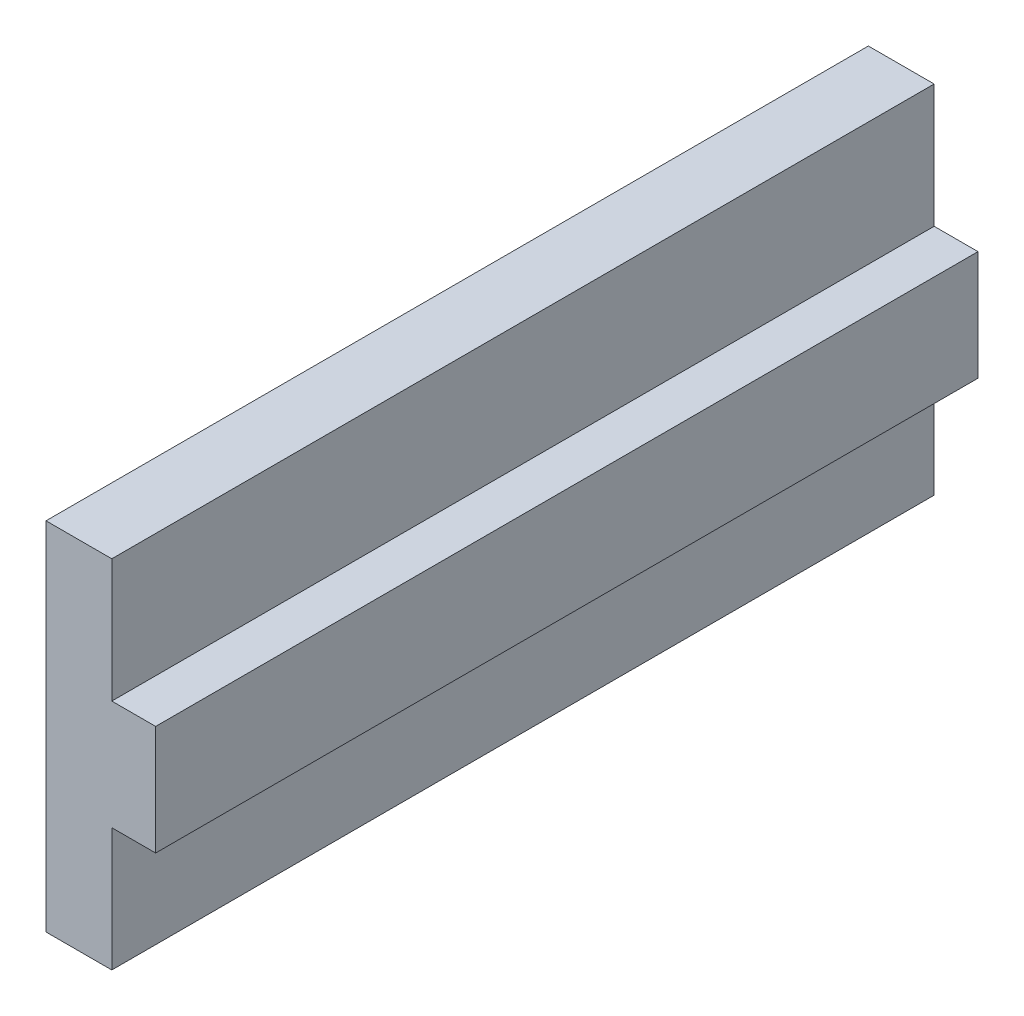
ISO-10303-21;
HEADER;
FILE_DESCRIPTION(('STEP AP214'),'2;1');
FILE_NAME('part.step','',(''),(''),'','','');
FILE_SCHEMA(('AUTOMOTIVE_DESIGN { 1 0 10303 214 1 1 1 1 }'));
ENDSEC;
DATA;
#1=APPLICATION_CONTEXT('core data for automotive mechanical design processes');
#2=APPLICATION_PROTOCOL_DEFINITION('international standard','automotive_design',2000,#1);
#3=PRODUCT_CONTEXT('',#1,'mechanical');
#4=PRODUCT('Part','Part','',(#3));
#5=PRODUCT_RELATED_PRODUCT_CATEGORY('part','',(#4));
#6=PRODUCT_DEFINITION_FORMATION('','',#4);
#7=PRODUCT_DEFINITION_CONTEXT('part definition',#1,'design');
#8=PRODUCT_DEFINITION('design','',#6,#7);
#9=PRODUCT_DEFINITION_SHAPE('','',#8);
#10=(LENGTH_UNIT() NAMED_UNIT(*) SI_UNIT(.MILLI.,.METRE.));
#11=(NAMED_UNIT(*) PLANE_ANGLE_UNIT() SI_UNIT($,.RADIAN.));
#12=(NAMED_UNIT(*) SI_UNIT($,.STERADIAN.) SOLID_ANGLE_UNIT());
#13=UNCERTAINTY_MEASURE_WITH_UNIT(LENGTH_MEASURE(1.E-05),#10,'distance_accuracy_value','');
#14=(GEOMETRIC_REPRESENTATION_CONTEXT(3) GLOBAL_UNCERTAINTY_ASSIGNED_CONTEXT((#13)) GLOBAL_UNIT_ASSIGNED_CONTEXT((#10,
#11,#12)) REPRESENTATION_CONTEXT('',''));
#15=CARTESIAN_POINT('',(0.,0.,0.));
#16=DIRECTION('',(0.,0.,1.));
#17=DIRECTION('',(1.,0.,0.));
#18=AXIS2_PLACEMENT_3D('',#15,#16,#17);
#19=CARTESIAN_POINT('',(3.81,0.,47.625));
#20=DIRECTION('',(0.,1.,0.));
#21=DIRECTION('',(-1.,0.,0.));
#22=AXIS2_PLACEMENT_3D('',#19,#20,#21);
#23=PLANE('',#22);
#24=DIRECTION('',(1.,0.,0.));
#25=VECTOR('',#24,1.);
#26=CARTESIAN_POINT('',(3.81,0.,0.));
#27=LINE('',#26,#25);
#28=CARTESIAN_POINT('',(0.,0.,0.));
#29=VERTEX_POINT('',#28);
#30=CARTESIAN_POINT('',(3.81,0.,0.));
#31=VERTEX_POINT('',#30);
#32=EDGE_CURVE('E131',#29,#31,#27,.T.);
#33=ORIENTED_EDGE('',*,*,#32,.T.);
#34=DIRECTION('',(0.,0.,-1.));
#35=VECTOR('',#34,1.);
#36=CARTESIAN_POINT('',(3.81,0.,47.625));
#37=LINE('',#36,#35);
#38=CARTESIAN_POINT('',(3.81,0.,47.625));
#39=VERTEX_POINT('',#38);
#40=EDGE_CURVE('E11',#39,#31,#37,.T.);
#41=ORIENTED_EDGE('',*,*,#40,.F.);
#42=DIRECTION('',(1.,0.,0.));
#43=VECTOR('',#42,1.);
#44=CARTESIAN_POINT('',(3.81,0.,47.625));
#45=LINE('',#44,#43);
#46=CARTESIAN_POINT('',(0.,0.,47.625));
#47=VERTEX_POINT('',#46);
#48=EDGE_CURVE('E145',#47,#39,#45,.T.);
#49=ORIENTED_EDGE('',*,*,#48,.F.);
#50=DIRECTION('',(0.,0.,-1.));
#51=VECTOR('',#50,1.);
#52=CARTESIAN_POINT('',(0.,0.,47.625));
#53=LINE('',#52,#51);
#54=EDGE_CURVE('E127',#47,#29,#53,.T.);
#55=ORIENTED_EDGE('',*,*,#54,.T.);
#56=EDGE_LOOP('',(#33,#41,#49,#55));
#57=FACE_BOUND('',#56,.T.);
#58=ADVANCED_FACE('F35',(#57),#23,.F.);
#59=CARTESIAN_POINT('',(3.81,7.1374,47.625));
#60=DIRECTION('',(-1.,0.,0.));
#61=DIRECTION('',(0.,0.,1.));
#62=AXIS2_PLACEMENT_3D('',#59,#60,#61);
#63=PLANE('',#62);
#64=DIRECTION('',(0.,1.,0.));
#65=VECTOR('',#64,1.);
#66=CARTESIAN_POINT('',(3.81,7.1374,0.));
#67=LINE('',#66,#65);
#68=CARTESIAN_POINT('',(3.81,7.1374,0.));
#69=VERTEX_POINT('',#68);
#70=EDGE_CURVE('E134',#31,#69,#67,.T.);
#71=ORIENTED_EDGE('',*,*,#70,.T.);
#72=DIRECTION('',(0.,0.,-1.));
#73=VECTOR('',#72,1.);
#74=CARTESIAN_POINT('',(3.81,7.1374,47.625));
#75=LINE('',#74,#73);
#76=CARTESIAN_POINT('',(3.81,7.1374,47.625));
#77=VERTEX_POINT('',#76);
#78=EDGE_CURVE('E43',#77,#69,#75,.T.);
#79=ORIENTED_EDGE('',*,*,#78,.F.);
#80=DIRECTION('',(0.,1.,0.));
#81=VECTOR('',#80,1.);
#82=CARTESIAN_POINT('',(3.81,7.1374,47.625));
#83=LINE('',#82,#81);
#84=EDGE_CURVE('E94',#39,#77,#83,.T.);
#85=ORIENTED_EDGE('',*,*,#84,.F.);
#86=ORIENTED_EDGE('',*,*,#40,.T.);
#87=EDGE_LOOP('',(#71,#79,#85,#86));
#88=FACE_BOUND('',#87,.T.);
#89=ADVANCED_FACE('F180',(#88),#63,.F.);
#90=CARTESIAN_POINT('',(6.35,7.1374,47.625));
#91=DIRECTION('',(0.,1.,0.));
#92=DIRECTION('',(-1.,0.,0.));
#93=AXIS2_PLACEMENT_3D('',#90,#91,#92);
#94=PLANE('',#93);
#95=DIRECTION('',(1.,0.,0.));
#96=VECTOR('',#95,1.);
#97=CARTESIAN_POINT('',(6.35,7.1374,0.));
#98=LINE('',#97,#96);
#99=CARTESIAN_POINT('',(6.35,7.1374,0.));
#100=VERTEX_POINT('',#99);
#101=EDGE_CURVE('E136',#69,#100,#98,.T.);
#102=ORIENTED_EDGE('',*,*,#101,.T.);
#103=DIRECTION('',(0.,0.,-1.));
#104=VECTOR('',#103,1.);
#105=CARTESIAN_POINT('',(6.35,7.1374,47.625));
#106=LINE('',#105,#104);
#107=CARTESIAN_POINT('',(6.35,7.1374,47.625));
#108=VERTEX_POINT('',#107);
#109=EDGE_CURVE('E152',#108,#100,#106,.T.);
#110=ORIENTED_EDGE('',*,*,#109,.F.);
#111=DIRECTION('',(1.,0.,0.));
#112=VECTOR('',#111,1.);
#113=CARTESIAN_POINT('',(6.35,7.1374,47.625));
#114=LINE('',#113,#112);
#115=EDGE_CURVE('E160',#77,#108,#114,.T.);
#116=ORIENTED_EDGE('',*,*,#115,.F.);
#117=ORIENTED_EDGE('',*,*,#78,.T.);
#118=EDGE_LOOP('',(#102,#110,#116,#117));
#119=FACE_BOUND('',#118,.T.);
#120=ADVANCED_FACE('F158',(#119),#94,.F.);
#121=CARTESIAN_POINT('',(6.35,13.4874,47.625));
#122=DIRECTION('',(-1.,0.,0.));
#123=DIRECTION('',(0.,0.,1.));
#124=AXIS2_PLACEMENT_3D('',#121,#122,#123);
#125=PLANE('',#124);
#126=DIRECTION('',(0.,1.,0.));
#127=VECTOR('',#126,1.);
#128=CARTESIAN_POINT('',(6.35,13.4874,0.));
#129=LINE('',#128,#127);
#130=CARTESIAN_POINT('',(6.35,13.4874,0.));
#131=VERTEX_POINT('',#130);
#132=EDGE_CURVE('E138',#100,#131,#129,.T.);
#133=ORIENTED_EDGE('',*,*,#132,.T.);
#134=DIRECTION('',(0.,0.,-1.));
#135=VECTOR('',#134,1.);
#136=CARTESIAN_POINT('',(6.35,13.4874,47.625));
#137=LINE('',#136,#135);
#138=CARTESIAN_POINT('',(6.35,13.4874,47.625));
#139=VERTEX_POINT('',#138);
#140=EDGE_CURVE('E149',#139,#131,#137,.T.);
#141=ORIENTED_EDGE('',*,*,#140,.F.);
#142=DIRECTION('',(0.,1.,0.));
#143=VECTOR('',#142,1.);
#144=CARTESIAN_POINT('',(6.35,13.4874,47.625));
#145=LINE('',#144,#143);
#146=EDGE_CURVE('E172',#108,#139,#145,.T.);
#147=ORIENTED_EDGE('',*,*,#146,.F.);
#148=ORIENTED_EDGE('',*,*,#109,.T.);
#149=EDGE_LOOP('',(#133,#141,#147,#148));
#150=FACE_BOUND('',#149,.T.);
#151=ADVANCED_FACE('F168',(#150),#125,.F.);
#152=CARTESIAN_POINT('',(3.81,13.4874,47.625));
#153=DIRECTION('',(0.,-1.,0.));
#154=DIRECTION('',(1.,0.,0.));
#155=AXIS2_PLACEMENT_3D('',#152,#153,#154);
#156=PLANE('',#155);
#157=DIRECTION('',(-1.,0.,0.));
#158=VECTOR('',#157,1.);
#159=CARTESIAN_POINT('',(3.81,13.4874,0.));
#160=LINE('',#159,#158);
#161=CARTESIAN_POINT('',(3.81,13.4874,0.));
#162=VERTEX_POINT('',#161);
#163=EDGE_CURVE('E140',#131,#162,#160,.T.);
#164=ORIENTED_EDGE('',*,*,#163,.T.);
#165=DIRECTION('',(0.,0.,-1.));
#166=VECTOR('',#165,1.);
#167=CARTESIAN_POINT('',(3.81,13.4874,47.625));
#168=LINE('',#167,#166);
#169=CARTESIAN_POINT('',(3.81,13.4874,47.625));
#170=VERTEX_POINT('',#169);
#171=EDGE_CURVE('E122',#170,#162,#168,.T.);
#172=ORIENTED_EDGE('',*,*,#171,.F.);
#173=DIRECTION('',(-1.,0.,0.));
#174=VECTOR('',#173,1.);
#175=CARTESIAN_POINT('',(3.81,13.4874,47.625));
#176=LINE('',#175,#174);
#177=EDGE_CURVE('E113',#139,#170,#176,.T.);
#178=ORIENTED_EDGE('',*,*,#177,.F.);
#179=ORIENTED_EDGE('',*,*,#140,.T.);
#180=EDGE_LOOP('',(#164,#172,#178,#179));
#181=FACE_BOUND('',#180,.T.);
#182=ADVANCED_FACE('F171',(#181),#156,.F.);
#183=CARTESIAN_POINT('',(3.81,20.6248,47.625));
#184=DIRECTION('',(-1.,0.,0.));
#185=DIRECTION('',(0.,-1.,0.));
#186=AXIS2_PLACEMENT_3D('',#183,#184,#185);
#187=PLANE('',#186);
#188=DIRECTION('',(0.,1.,0.));
#189=VECTOR('',#188,1.);
#190=CARTESIAN_POINT('',(3.81,20.6248,0.));
#191=LINE('',#190,#189);
#192=CARTESIAN_POINT('',(3.81,20.6248,0.));
#193=VERTEX_POINT('',#192);
#194=EDGE_CURVE('E121',#162,#193,#191,.T.);
#195=ORIENTED_EDGE('',*,*,#194,.T.);
#196=DIRECTION('',(0.,0.,-1.));
#197=VECTOR('',#196,1.);
#198=CARTESIAN_POINT('',(3.81,20.6248,47.625));
#199=LINE('',#198,#197);
#200=CARTESIAN_POINT('',(3.81,20.6248,47.625));
#201=VERTEX_POINT('',#200);
#202=EDGE_CURVE('E118',#201,#193,#199,.T.);
#203=ORIENTED_EDGE('',*,*,#202,.F.);
#204=DIRECTION('',(0.,1.,0.));
#205=VECTOR('',#204,1.);
#206=CARTESIAN_POINT('',(3.81,20.6248,47.625));
#207=LINE('',#206,#205);
#208=EDGE_CURVE('E107',#170,#201,#207,.T.);
#209=ORIENTED_EDGE('',*,*,#208,.F.);
#210=ORIENTED_EDGE('',*,*,#171,.T.);
#211=EDGE_LOOP('',(#195,#203,#209,#210));
#212=FACE_BOUND('',#211,.T.);
#213=ADVANCED_FACE('F119',(#212),#187,.F.);
#214=CARTESIAN_POINT('',(0.,20.6248,47.625));
#215=DIRECTION('',(0.,-1.,0.));
#216=DIRECTION('',(0.,0.,-1.));
#217=AXIS2_PLACEMENT_3D('',#214,#215,#216);
#218=PLANE('',#217);
#219=DIRECTION('',(-1.,0.,0.));
#220=VECTOR('',#219,1.);
#221=CARTESIAN_POINT('',(0.,20.6248,0.));
#222=LINE('',#221,#220);
#223=CARTESIAN_POINT('',(0.,20.6248,0.));
#224=VERTEX_POINT('',#223);
#225=EDGE_CURVE('E80',#193,#224,#222,.T.);
#226=ORIENTED_EDGE('',*,*,#225,.T.);
#227=DIRECTION('',(0.,0.,-1.));
#228=VECTOR('',#227,1.);
#229=CARTESIAN_POINT('',(0.,20.6248,47.625));
#230=LINE('',#229,#228);
#231=CARTESIAN_POINT('',(0.,20.6248,47.625));
#232=VERTEX_POINT('',#231);
#233=EDGE_CURVE('E123',#232,#224,#230,.T.);
#234=ORIENTED_EDGE('',*,*,#233,.F.);
#235=DIRECTION('',(-1.,0.,0.));
#236=VECTOR('',#235,1.);
#237=CARTESIAN_POINT('',(0.,20.6248,47.625));
#238=LINE('',#237,#236);
#239=EDGE_CURVE('E111',#201,#232,#238,.T.);
#240=ORIENTED_EDGE('',*,*,#239,.F.);
#241=ORIENTED_EDGE('',*,*,#202,.T.);
#242=EDGE_LOOP('',(#226,#234,#240,#241));
#243=FACE_BOUND('',#242,.T.);
#244=ADVANCED_FACE('F125',(#243),#218,.F.);
#245=CARTESIAN_POINT('',(0.,0.,47.625));
#246=DIRECTION('',(1.,0.,0.));
#247=DIRECTION('',(0.,0.,-1.));
#248=AXIS2_PLACEMENT_3D('',#245,#246,#247);
#249=PLANE('',#248);
#250=DIRECTION('',(0.,-1.,0.));
#251=VECTOR('',#250,1.);
#252=CARTESIAN_POINT('',(0.,0.,0.));
#253=LINE('',#252,#251);
#254=EDGE_CURVE('E86',#224,#29,#253,.T.);
#255=ORIENTED_EDGE('',*,*,#254,.T.);
#256=ORIENTED_EDGE('',*,*,#54,.F.);
#257=DIRECTION('',(0.,-1.,0.));
#258=VECTOR('',#257,1.);
#259=CARTESIAN_POINT('',(0.,0.,47.625));
#260=LINE('',#259,#258);
#261=EDGE_CURVE('E51',#232,#47,#260,.T.);
#262=ORIENTED_EDGE('',*,*,#261,.F.);
#263=ORIENTED_EDGE('',*,*,#233,.T.);
#264=EDGE_LOOP('',(#255,#256,#262,#263));
#265=FACE_BOUND('',#264,.T.);
#266=ADVANCED_FACE('F196',(#265),#249,.F.);
#267=CARTESIAN_POINT('',(0.,0.,47.625));
#268=DIRECTION('',(0.,0.,-1.));
#269=DIRECTION('',(-1.,0.,0.));
#270=AXIS2_PLACEMENT_3D('',#267,#268,#269);
#271=PLANE('',#270);
#272=ORIENTED_EDGE('',*,*,#48,.T.);
#273=ORIENTED_EDGE('',*,*,#84,.T.);
#274=ORIENTED_EDGE('',*,*,#115,.T.);
#275=ORIENTED_EDGE('',*,*,#146,.T.);
#276=ORIENTED_EDGE('',*,*,#177,.T.);
#277=ORIENTED_EDGE('',*,*,#208,.T.);
#278=ORIENTED_EDGE('',*,*,#239,.T.);
#279=ORIENTED_EDGE('',*,*,#261,.T.);
#280=EDGE_LOOP('',(#272,#273,#274,#275,#276,#277,#278,#279));
#281=FACE_BOUND('',#280,.T.);
#282=ADVANCED_FACE('F109',(#281),#271,.F.);
#283=CARTESIAN_POINT('',(0.,0.,0.));
#284=DIRECTION('',(0.,0.,-1.));
#285=DIRECTION('',(-1.,0.,0.));
#286=AXIS2_PLACEMENT_3D('',#283,#284,#285);
#287=PLANE('',#286);
#288=ORIENTED_EDGE('',*,*,#32,.F.);
#289=ORIENTED_EDGE('',*,*,#254,.F.);
#290=ORIENTED_EDGE('',*,*,#225,.F.);
#291=ORIENTED_EDGE('',*,*,#194,.F.);
#292=ORIENTED_EDGE('',*,*,#163,.F.);
#293=ORIENTED_EDGE('',*,*,#132,.F.);
#294=ORIENTED_EDGE('',*,*,#101,.F.);
#295=ORIENTED_EDGE('',*,*,#70,.F.);
#296=EDGE_LOOP('',(#288,#289,#290,#291,#292,#293,#294,#295));
#297=FACE_BOUND('',#296,.T.);
#298=ADVANCED_FACE('F164',(#297),#287,.T.);
#299=CLOSED_SHELL('',(#58,#89,#120,#151,#182,#213,#244,#266,#282,#298));
#300=MANIFOLD_SOLID_BREP('B2',#299);
#301=ADVANCED_BREP_SHAPE_REPRESENTATION('',(#18,#300),#14);
#302=SHAPE_DEFINITION_REPRESENTATION(#9,#301);
ENDSEC;
END-ISO-10303-21;
